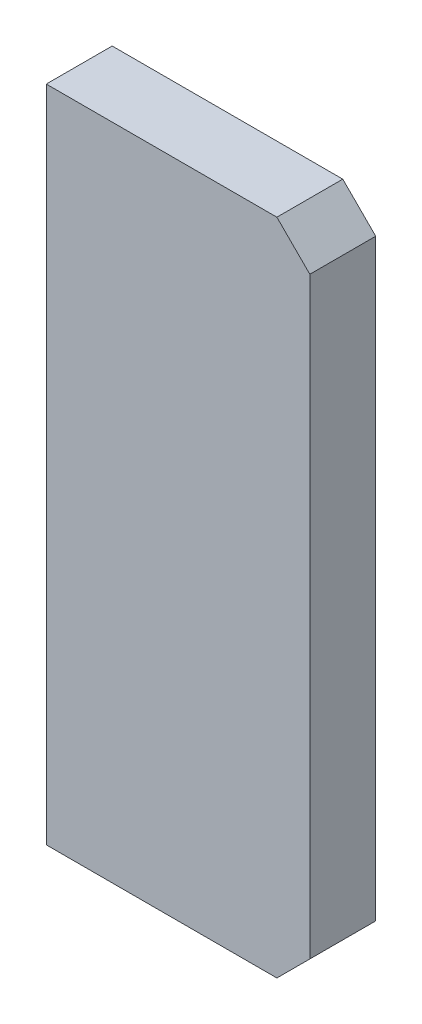
ISO-10303-21;
HEADER;
FILE_DESCRIPTION(('STEP AP214'),'2;1');
FILE_NAME('part.step','',(''),(''),'','','');
FILE_SCHEMA(('AUTOMOTIVE_DESIGN { 1 0 10303 214 1 1 1 1 }'));
ENDSEC;
DATA;
#1=APPLICATION_CONTEXT('core data for automotive mechanical design processes');
#2=APPLICATION_PROTOCOL_DEFINITION('international standard','automotive_design',2000,#1);
#3=PRODUCT_CONTEXT('',#1,'mechanical');
#4=PRODUCT('Part','Part','',(#3));
#5=PRODUCT_RELATED_PRODUCT_CATEGORY('part','',(#4));
#6=PRODUCT_DEFINITION_FORMATION('','',#4);
#7=PRODUCT_DEFINITION_CONTEXT('part definition',#1,'design');
#8=PRODUCT_DEFINITION('design','',#6,#7);
#9=PRODUCT_DEFINITION_SHAPE('','',#8);
#10=(LENGTH_UNIT() NAMED_UNIT(*) SI_UNIT(.MILLI.,.METRE.));
#11=(NAMED_UNIT(*) PLANE_ANGLE_UNIT() SI_UNIT($,.RADIAN.));
#12=(NAMED_UNIT(*) SI_UNIT($,.STERADIAN.) SOLID_ANGLE_UNIT());
#13=UNCERTAINTY_MEASURE_WITH_UNIT(LENGTH_MEASURE(1.E-05),#10,'distance_accuracy_value','');
#14=(GEOMETRIC_REPRESENTATION_CONTEXT(3) GLOBAL_UNCERTAINTY_ASSIGNED_CONTEXT((#13)) GLOBAL_UNIT_ASSIGNED_CONTEXT((#10,
#11,#12)) REPRESENTATION_CONTEXT('',''));
#15=CARTESIAN_POINT('',(0.,0.,0.));
#16=DIRECTION('',(0.,0.,1.));
#17=DIRECTION('',(1.,0.,0.));
#18=AXIS2_PLACEMENT_3D('',#15,#16,#17);
#19=CARTESIAN_POINT('',(200.,500.,100.));
#20=DIRECTION('',(0.,-1.,0.));
#21=DIRECTION('',(0.,0.,-1.));
#22=AXIS2_PLACEMENT_3D('',#19,#20,#21);
#23=PLANE('',#22);
#24=DIRECTION('',(-1.,0.,0.));
#25=VECTOR('',#24,1.);
#26=CARTESIAN_POINT('',(200.,500.,100.));
#27=LINE('',#26,#25);
#28=CARTESIAN_POINT('',(150.,500.,100.));
#29=VERTEX_POINT('',#28);
#30=CARTESIAN_POINT('',(-200.,500.,100.));
#31=VERTEX_POINT('',#30);
#32=EDGE_CURVE('E92',#29,#31,#27,.T.);
#33=ORIENTED_EDGE('',*,*,#32,.F.);
#34=DIRECTION('',(0.,0.,-1.));
#35=VECTOR('',#34,1.);
#36=CARTESIAN_POINT('',(150.,500.,100.));
#37=LINE('',#36,#35);
#38=CARTESIAN_POINT('',(150.,500.,0.));
#39=VERTEX_POINT('',#38);
#40=EDGE_CURVE('E11',#29,#39,#37,.T.);
#41=ORIENTED_EDGE('',*,*,#40,.T.);
#42=DIRECTION('',(-1.,0.,0.));
#43=VECTOR('',#42,1.);
#44=CARTESIAN_POINT('',(200.,500.,0.));
#45=LINE('',#44,#43);
#46=CARTESIAN_POINT('',(-200.,500.,0.));
#47=VERTEX_POINT('',#46);
#48=EDGE_CURVE('E111',#39,#47,#45,.T.);
#49=ORIENTED_EDGE('',*,*,#48,.T.);
#50=DIRECTION('',(0.,0.,-1.));
#51=VECTOR('',#50,1.);
#52=CARTESIAN_POINT('',(-200.,500.,100.));
#53=LINE('',#52,#51);
#54=EDGE_CURVE('E107',#31,#47,#53,.T.);
#55=ORIENTED_EDGE('',*,*,#54,.F.);
#56=EDGE_LOOP('',(#33,#41,#49,#55));
#57=FACE_BOUND('',#56,.T.);
#58=ADVANCED_FACE('F41',(#57),#23,.F.);
#59=CARTESIAN_POINT('',(-200.,-500.,100.));
#60=DIRECTION('',(1.,0.,0.));
#61=DIRECTION('',(0.,0.,-1.));
#62=AXIS2_PLACEMENT_3D('',#59,#60,#61);
#63=PLANE('',#62);
#64=DIRECTION('',(0.,-1.,0.));
#65=VECTOR('',#64,1.);
#66=CARTESIAN_POINT('',(-200.,-500.,0.));
#67=LINE('',#66,#65);
#68=CARTESIAN_POINT('',(-200.,-500.,0.));
#69=VERTEX_POINT('',#68);
#70=EDGE_CURVE('E150',#47,#69,#67,.T.);
#71=ORIENTED_EDGE('',*,*,#70,.T.);
#72=DIRECTION('',(0.,0.,-1.));
#73=VECTOR('',#72,1.);
#74=CARTESIAN_POINT('',(-200.,-500.,100.));
#75=LINE('',#74,#73);
#76=CARTESIAN_POINT('',(-200.,-500.,100.));
#77=VERTEX_POINT('',#76);
#78=EDGE_CURVE('E109',#77,#69,#75,.T.);
#79=ORIENTED_EDGE('',*,*,#78,.F.);
#80=DIRECTION('',(0.,-1.,0.));
#81=VECTOR('',#80,1.);
#82=CARTESIAN_POINT('',(-200.,-500.,100.));
#83=LINE('',#82,#81);
#84=EDGE_CURVE('E98',#31,#77,#83,.T.);
#85=ORIENTED_EDGE('',*,*,#84,.F.);
#86=ORIENTED_EDGE('',*,*,#54,.T.);
#87=EDGE_LOOP('',(#71,#79,#85,#86));
#88=FACE_BOUND('',#87,.T.);
#89=ADVANCED_FACE('F110',(#88),#63,.F.);
#90=CARTESIAN_POINT('',(200.,-500.,100.));
#91=DIRECTION('',(0.,1.,0.));
#92=DIRECTION('',(0.,0.,1.));
#93=AXIS2_PLACEMENT_3D('',#90,#91,#92);
#94=PLANE('',#93);
#95=DIRECTION('',(1.,0.,0.));
#96=VECTOR('',#95,1.);
#97=CARTESIAN_POINT('',(200.,-500.,0.));
#98=LINE('',#97,#96);
#99=CARTESIAN_POINT('',(150.,-500.,0.));
#100=VERTEX_POINT('',#99);
#101=EDGE_CURVE('E144',#69,#100,#98,.T.);
#102=ORIENTED_EDGE('',*,*,#101,.T.);
#103=DIRECTION('',(0.,0.,1.));
#104=VECTOR('',#103,1.);
#105=CARTESIAN_POINT('',(150.,-500.,100.));
#106=LINE('',#105,#104);
#107=CARTESIAN_POINT('',(150.,-500.,100.));
#108=VERTEX_POINT('',#107);
#109=EDGE_CURVE('E63',#100,#108,#106,.T.);
#110=ORIENTED_EDGE('',*,*,#109,.T.);
#111=DIRECTION('',(1.,0.,0.));
#112=VECTOR('',#111,1.);
#113=CARTESIAN_POINT('',(200.,-500.,100.));
#114=LINE('',#113,#112);
#115=EDGE_CURVE('E112',#77,#108,#114,.T.);
#116=ORIENTED_EDGE('',*,*,#115,.F.);
#117=ORIENTED_EDGE('',*,*,#78,.T.);
#118=EDGE_LOOP('',(#102,#110,#116,#117));
#119=FACE_BOUND('',#118,.T.);
#120=ADVANCED_FACE('F148',(#119),#94,.F.);
#121=CARTESIAN_POINT('',(200.,-500.,100.));
#122=DIRECTION('',(-1.,0.,0.));
#123=DIRECTION('',(0.,0.,1.));
#124=AXIS2_PLACEMENT_3D('',#121,#122,#123);
#125=PLANE('',#124);
#126=DIRECTION('',(0.,1.,0.));
#127=VECTOR('',#126,1.);
#128=CARTESIAN_POINT('',(200.,-500.,100.));
#129=LINE('',#128,#127);
#130=CARTESIAN_POINT('',(200.,-450.,100.));
#131=VERTEX_POINT('',#130);
#132=CARTESIAN_POINT('',(200.,450.,100.));
#133=VERTEX_POINT('',#132);
#134=EDGE_CURVE('E118',#131,#133,#129,.T.);
#135=ORIENTED_EDGE('',*,*,#134,.F.);
#136=DIRECTION('',(0.,0.,-1.));
#137=VECTOR('',#136,1.);
#138=CARTESIAN_POINT('',(200.,-450.,100.));
#139=LINE('',#138,#137);
#140=CARTESIAN_POINT('',(200.,-450.,0.));
#141=VERTEX_POINT('',#140);
#142=EDGE_CURVE('E119',#131,#141,#139,.T.);
#143=ORIENTED_EDGE('',*,*,#142,.T.);
#144=DIRECTION('',(0.,1.,0.));
#145=VECTOR('',#144,1.);
#146=CARTESIAN_POINT('',(200.,-500.,0.));
#147=LINE('',#146,#145);
#148=CARTESIAN_POINT('',(200.,450.,0.));
#149=VERTEX_POINT('',#148);
#150=EDGE_CURVE('E103',#141,#149,#147,.T.);
#151=ORIENTED_EDGE('',*,*,#150,.T.);
#152=DIRECTION('',(0.,0.,1.));
#153=VECTOR('',#152,1.);
#154=CARTESIAN_POINT('',(200.,450.,100.));
#155=LINE('',#154,#153);
#156=EDGE_CURVE('E117',#149,#133,#155,.T.);
#157=ORIENTED_EDGE('',*,*,#156,.T.);
#158=EDGE_LOOP('',(#135,#143,#151,#157));
#159=FACE_BOUND('',#158,.T.);
#160=ADVANCED_FACE('F138',(#159),#125,.F.);
#161=CARTESIAN_POINT('',(0.,0.,100.));
#162=DIRECTION('',(0.,0.,-1.));
#163=DIRECTION('',(-1.,0.,0.));
#164=AXIS2_PLACEMENT_3D('',#161,#162,#163);
#165=PLANE('',#164);
#166=ORIENTED_EDGE('',*,*,#115,.T.);
#167=DIRECTION('',(-0.707106781186548,-0.707106781186547,0.));
#168=VECTOR('',#167,1.);
#169=CARTESIAN_POINT('',(200.,-450.,100.));
#170=LINE('',#169,#168);
#171=EDGE_CURVE('E49',#108,#131,#170,.F.);
#172=ORIENTED_EDGE('',*,*,#171,.T.);
#173=ORIENTED_EDGE('',*,*,#134,.T.);
#174=DIRECTION('',(0.707106781186547,-0.707106781186548,0.));
#175=VECTOR('',#174,1.);
#176=CARTESIAN_POINT('',(150.,500.,100.));
#177=LINE('',#176,#175);
#178=EDGE_CURVE('E60',#133,#29,#177,.F.);
#179=ORIENTED_EDGE('',*,*,#178,.T.);
#180=ORIENTED_EDGE('',*,*,#32,.T.);
#181=ORIENTED_EDGE('',*,*,#84,.T.);
#182=EDGE_LOOP('',(#166,#172,#173,#179,#180,#181));
#183=FACE_BOUND('',#182,.T.);
#184=ADVANCED_FACE('F100',(#183),#165,.F.);
#185=CARTESIAN_POINT('',(0.,0.,0.));
#186=DIRECTION('',(0.,0.,-1.));
#187=DIRECTION('',(-1.,0.,0.));
#188=AXIS2_PLACEMENT_3D('',#185,#186,#187);
#189=PLANE('',#188);
#190=ORIENTED_EDGE('',*,*,#150,.F.);
#191=DIRECTION('',(0.707106781186548,0.707106781186547,0.));
#192=VECTOR('',#191,1.);
#193=CARTESIAN_POINT('',(325.,-325.,0.));
#194=LINE('',#193,#192);
#195=EDGE_CURVE('E126',#141,#100,#194,.F.);
#196=ORIENTED_EDGE('',*,*,#195,.T.);
#197=ORIENTED_EDGE('',*,*,#101,.F.);
#198=ORIENTED_EDGE('',*,*,#70,.F.);
#199=ORIENTED_EDGE('',*,*,#48,.F.);
#200=DIRECTION('',(-0.707106781186547,0.707106781186548,0.));
#201=VECTOR('',#200,1.);
#202=CARTESIAN_POINT('',(325.,324.999999999999,0.));
#203=LINE('',#202,#201);
#204=EDGE_CURVE('E127',#39,#149,#203,.F.);
#205=ORIENTED_EDGE('',*,*,#204,.T.);
#206=EDGE_LOOP('',(#190,#196,#197,#198,#199,#205));
#207=FACE_BOUND('',#206,.T.);
#208=ADVANCED_FACE('F145',(#207),#189,.T.);
#209=CARTESIAN_POINT('',(200.,-450.,100.));
#210=DIRECTION('',(-0.707106781186547,0.707106781186548,0.));
#211=DIRECTION('',(0.,0.,-1.));
#212=AXIS2_PLACEMENT_3D('',#209,#210,#211);
#213=PLANE('',#212);
#214=ORIENTED_EDGE('',*,*,#171,.F.);
#215=ORIENTED_EDGE('',*,*,#109,.F.);
#216=ORIENTED_EDGE('',*,*,#195,.F.);
#217=ORIENTED_EDGE('',*,*,#142,.F.);
#218=EDGE_LOOP('',(#214,#215,#216,#217));
#219=FACE_BOUND('',#218,.T.);
#220=ADVANCED_FACE('F143',(#219),#213,.F.);
#221=CARTESIAN_POINT('',(150.,500.,100.));
#222=DIRECTION('',(-0.707106781186548,-0.707106781186547,0.));
#223=DIRECTION('',(0.,0.,-1.));
#224=AXIS2_PLACEMENT_3D('',#221,#222,#223);
#225=PLANE('',#224);
#226=ORIENTED_EDGE('',*,*,#178,.F.);
#227=ORIENTED_EDGE('',*,*,#156,.F.);
#228=ORIENTED_EDGE('',*,*,#204,.F.);
#229=ORIENTED_EDGE('',*,*,#40,.F.);
#230=EDGE_LOOP('',(#226,#227,#228,#229));
#231=FACE_BOUND('',#230,.T.);
#232=ADVANCED_FACE('F42',(#231),#225,.F.);
#233=CLOSED_SHELL('',(#58,#89,#120,#160,#184,#208,#220,#232));
#234=MANIFOLD_SOLID_BREP('B2',#233);
#235=ADVANCED_BREP_SHAPE_REPRESENTATION('',(#18,#234),#14);
#236=SHAPE_DEFINITION_REPRESENTATION(#9,#235);
ENDSEC;
END-ISO-10303-21;
